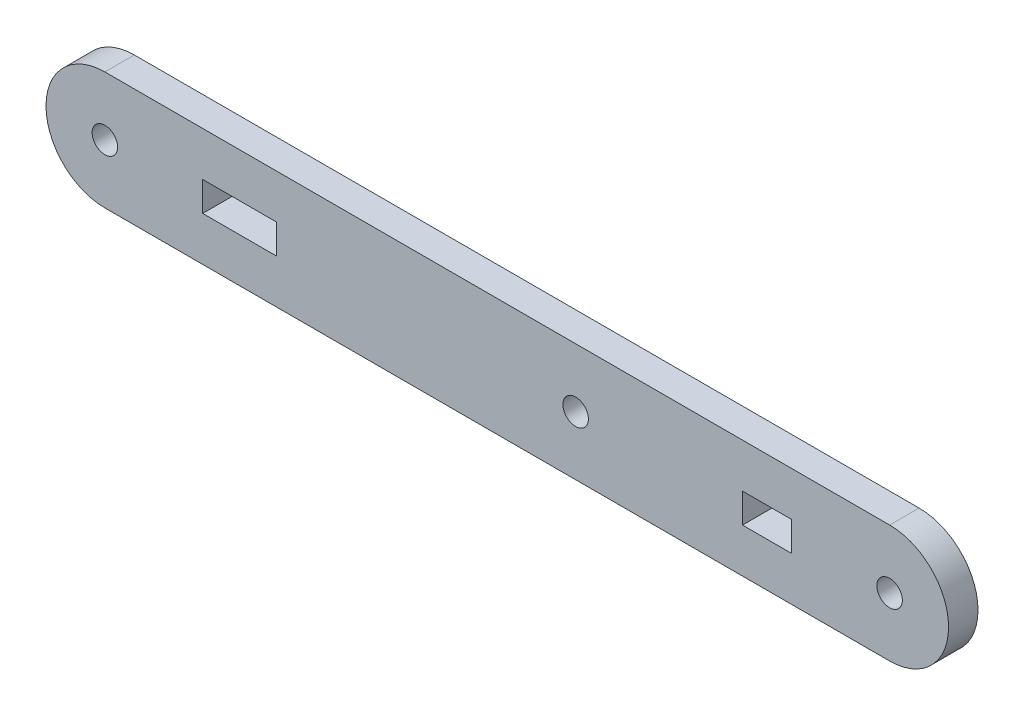
ISO-10303-21;
HEADER;
FILE_DESCRIPTION(('STEP AP214'),'2;1');
FILE_NAME('part.step','',(''),(''),'','','');
FILE_SCHEMA(('AUTOMOTIVE_DESIGN { 1 0 10303 214 1 1 1 1 }'));
ENDSEC;
DATA;
#1=APPLICATION_CONTEXT('core data for automotive mechanical design processes');
#2=APPLICATION_PROTOCOL_DEFINITION('international standard','automotive_design',2000,#1);
#3=PRODUCT_CONTEXT('',#1,'mechanical');
#4=PRODUCT('Part','Part','',(#3));
#5=PRODUCT_RELATED_PRODUCT_CATEGORY('part','',(#4));
#6=PRODUCT_DEFINITION_FORMATION('','',#4);
#7=PRODUCT_DEFINITION_CONTEXT('part definition',#1,'design');
#8=PRODUCT_DEFINITION('design','',#6,#7);
#9=PRODUCT_DEFINITION_SHAPE('','',#8);
#10=(LENGTH_UNIT() NAMED_UNIT(*) SI_UNIT(.MILLI.,.METRE.));
#11=(NAMED_UNIT(*) PLANE_ANGLE_UNIT() SI_UNIT($,.RADIAN.));
#12=(NAMED_UNIT(*) SI_UNIT($,.STERADIAN.) SOLID_ANGLE_UNIT());
#13=UNCERTAINTY_MEASURE_WITH_UNIT(LENGTH_MEASURE(1.E-05),#10,'distance_accuracy_value','');
#14=(GEOMETRIC_REPRESENTATION_CONTEXT(3) GLOBAL_UNCERTAINTY_ASSIGNED_CONTEXT((#13)) GLOBAL_UNIT_ASSIGNED_CONTEXT((#10,
#11,#12)) REPRESENTATION_CONTEXT('',''));
#15=CARTESIAN_POINT('',(0.,0.,0.));
#16=DIRECTION('',(0.,0.,1.));
#17=DIRECTION('',(1.,0.,0.));
#18=AXIS2_PLACEMENT_3D('',#15,#16,#17);
#19=CARTESIAN_POINT('',(-49.3435107871291,6.,0.));
#20=DIRECTION('',(0.,0.,1.));
#21=DIRECTION('',(1.,0.,0.));
#22=AXIS2_PLACEMENT_3D('',#19,#20,#21);
#23=CYLINDRICAL_SURFACE('',#22,6.);
#24=CARTESIAN_POINT('',(-49.3435107871291,6.,3.));
#25=DIRECTION('',(0.,0.,1.));
#26=DIRECTION('',(1.,0.,0.));
#27=AXIS2_PLACEMENT_3D('',#24,#25,#26);
#28=CIRCLE('',#27,6.);
#29=CARTESIAN_POINT('',(-49.3435107871291,12.,3.));
#30=VERTEX_POINT('',#29);
#31=CARTESIAN_POINT('',(-49.3435107871291,0.,3.));
#32=VERTEX_POINT('',#31);
#33=EDGE_CURVE('E210',#30,#32,#28,.T.);
#34=ORIENTED_EDGE('',*,*,#33,.F.);
#35=DIRECTION('',(0.,0.,1.));
#36=VECTOR('',#35,1.);
#37=CARTESIAN_POINT('',(-49.3435107871291,12.,0.));
#38=LINE('',#37,#36);
#39=CARTESIAN_POINT('',(-49.3435107871291,12.,0.));
#40=VERTEX_POINT('',#39);
#41=EDGE_CURVE('E11',#40,#30,#38,.T.);
#42=ORIENTED_EDGE('',*,*,#41,.F.);
#43=CARTESIAN_POINT('',(-49.3435107871291,6.,0.));
#44=DIRECTION('',(0.,0.,1.));
#45=DIRECTION('',(1.,0.,0.));
#46=AXIS2_PLACEMENT_3D('',#43,#44,#45);
#47=CIRCLE('',#46,6.);
#48=CARTESIAN_POINT('',(-49.3435107871291,0.,0.));
#49=VERTEX_POINT('',#48);
#50=EDGE_CURVE('E213',#40,#49,#47,.T.);
#51=ORIENTED_EDGE('',*,*,#50,.T.);
#52=DIRECTION('',(0.,0.,1.));
#53=VECTOR('',#52,1.);
#54=CARTESIAN_POINT('',(-49.3435107871291,0.,0.));
#55=LINE('',#54,#53);
#56=EDGE_CURVE('E40',#49,#32,#55,.T.);
#57=ORIENTED_EDGE('',*,*,#56,.T.);
#58=EDGE_LOOP('',(#34,#42,#51,#57));
#59=FACE_BOUND('',#58,.T.);
#60=ADVANCED_FACE('F37',(#59),#23,.T.);
#61=CARTESIAN_POINT('',(30.6181719329405,12.,0.));
#62=DIRECTION('',(0.,1.,0.));
#63=DIRECTION('',(0.,0.,1.));
#64=AXIS2_PLACEMENT_3D('',#61,#62,#63);
#65=PLANE('',#64);
#66=DIRECTION('',(-1.,0.,0.));
#67=VECTOR('',#66,1.);
#68=CARTESIAN_POINT('',(30.6181719329405,12.,3.));
#69=LINE('',#68,#67);
#70=CARTESIAN_POINT('',(30.6181719329405,12.,3.));
#71=VERTEX_POINT('',#70);
#72=EDGE_CURVE('E217',#71,#30,#69,.T.);
#73=ORIENTED_EDGE('',*,*,#72,.F.);
#74=DIRECTION('',(0.,0.,1.));
#75=VECTOR('',#74,1.);
#76=CARTESIAN_POINT('',(30.6181719329405,12.,0.));
#77=LINE('',#76,#75);
#78=CARTESIAN_POINT('',(30.6181719329405,12.,0.));
#79=VERTEX_POINT('',#78);
#80=EDGE_CURVE('E45',#79,#71,#77,.T.);
#81=ORIENTED_EDGE('',*,*,#80,.F.);
#82=DIRECTION('',(-1.,0.,0.));
#83=VECTOR('',#82,1.);
#84=CARTESIAN_POINT('',(30.6181719329405,12.,0.));
#85=LINE('',#84,#83);
#86=EDGE_CURVE('E223',#79,#40,#85,.T.);
#87=ORIENTED_EDGE('',*,*,#86,.T.);
#88=ORIENTED_EDGE('',*,*,#41,.T.);
#89=EDGE_LOOP('',(#73,#81,#87,#88));
#90=FACE_BOUND('',#89,.T.);
#91=ADVANCED_FACE('F249',(#90),#65,.T.);
#92=CARTESIAN_POINT('',(30.6181719329405,6.,0.));
#93=DIRECTION('',(0.,0.,1.));
#94=DIRECTION('',(1.,0.,0.));
#95=AXIS2_PLACEMENT_3D('',#92,#93,#94);
#96=CYLINDRICAL_SURFACE('',#95,6.);
#97=CARTESIAN_POINT('',(30.6181719329405,6.,3.));
#98=DIRECTION('',(0.,0.,1.));
#99=DIRECTION('',(1.,0.,0.));
#100=AXIS2_PLACEMENT_3D('',#97,#98,#99);
#101=CIRCLE('',#100,6.);
#102=CARTESIAN_POINT('',(30.6181719329405,0.,3.));
#103=VERTEX_POINT('',#102);
#104=EDGE_CURVE('E231',#103,#71,#101,.T.);
#105=ORIENTED_EDGE('',*,*,#104,.F.);
#106=DIRECTION('',(0.,0.,1.));
#107=VECTOR('',#106,1.);
#108=CARTESIAN_POINT('',(30.6181719329405,0.,0.));
#109=LINE('',#108,#107);
#110=CARTESIAN_POINT('',(30.6181719329405,0.,0.));
#111=VERTEX_POINT('',#110);
#112=EDGE_CURVE('E236',#111,#103,#109,.T.);
#113=ORIENTED_EDGE('',*,*,#112,.F.);
#114=CARTESIAN_POINT('',(30.6181719329405,6.,0.));
#115=DIRECTION('',(0.,0.,1.));
#116=DIRECTION('',(1.,0.,0.));
#117=AXIS2_PLACEMENT_3D('',#114,#115,#116);
#118=CIRCLE('',#117,6.);
#119=EDGE_CURVE('E220',#111,#79,#118,.T.);
#120=ORIENTED_EDGE('',*,*,#119,.T.);
#121=ORIENTED_EDGE('',*,*,#80,.T.);
#122=EDGE_LOOP('',(#105,#113,#120,#121));
#123=FACE_BOUND('',#122,.T.);
#124=ADVANCED_FACE('F254',(#123),#96,.T.);
#125=CARTESIAN_POINT('',(-49.3435107871291,0.,0.));
#126=DIRECTION('',(0.,-1.,0.));
#127=DIRECTION('',(0.,0.,-1.));
#128=AXIS2_PLACEMENT_3D('',#125,#126,#127);
#129=PLANE('',#128);
#130=DIRECTION('',(1.,0.,0.));
#131=VECTOR('',#130,1.);
#132=CARTESIAN_POINT('',(-49.3435107871291,0.,3.));
#133=LINE('',#132,#131);
#134=EDGE_CURVE('E228',#32,#103,#133,.T.);
#135=ORIENTED_EDGE('',*,*,#134,.F.);
#136=ORIENTED_EDGE('',*,*,#56,.F.);
#137=DIRECTION('',(1.,0.,0.));
#138=VECTOR('',#137,1.);
#139=CARTESIAN_POINT('',(-49.3435107871291,0.,0.));
#140=LINE('',#139,#138);
#141=EDGE_CURVE('E216',#49,#111,#140,.T.);
#142=ORIENTED_EDGE('',*,*,#141,.T.);
#143=ORIENTED_EDGE('',*,*,#112,.T.);
#144=EDGE_LOOP('',(#135,#136,#142,#143));
#145=FACE_BOUND('',#144,.T.);
#146=ADVANCED_FACE('F244',(#145),#129,.T.);
#147=CARTESIAN_POINT('',(-49.3435107871291,6.,0.));
#148=DIRECTION('',(0.,0.,1.));
#149=DIRECTION('',(1.,0.,0.));
#150=AXIS2_PLACEMENT_3D('',#147,#148,#149);
#151=PLANE('',#150);
#152=DIRECTION('',(1.,0.,0.));
#153=VECTOR('',#152,1.);
#154=CARTESIAN_POINT('',(20.6213066975977,4.4994,0.));
#155=LINE('',#154,#153);
#156=CARTESIAN_POINT('',(15.6218066975976,4.4994,0.));
#157=VERTEX_POINT('',#156);
#158=CARTESIAN_POINT('',(20.6213066975977,4.4994,0.));
#159=VERTEX_POINT('',#158);
#160=EDGE_CURVE('E134',#157,#159,#155,.T.);
#161=ORIENTED_EDGE('',*,*,#160,.T.);
#162=DIRECTION('',(0.,1.,0.));
#163=VECTOR('',#162,1.);
#164=CARTESIAN_POINT('',(20.6213066975977,7.4995,0.));
#165=LINE('',#164,#163);
#166=CARTESIAN_POINT('',(20.6213066975977,7.4995,0.));
#167=VERTEX_POINT('',#166);
#168=EDGE_CURVE('E128',#159,#167,#165,.T.);
#169=ORIENTED_EDGE('',*,*,#168,.T.);
#170=DIRECTION('',(-1.,0.,0.));
#171=VECTOR('',#170,1.);
#172=CARTESIAN_POINT('',(15.6218066975976,7.4995,0.));
#173=LINE('',#172,#171);
#174=CARTESIAN_POINT('',(15.6218066975976,7.4995,0.));
#175=VERTEX_POINT('',#174);
#176=EDGE_CURVE('E137',#167,#175,#173,.T.);
#177=ORIENTED_EDGE('',*,*,#176,.T.);
#178=DIRECTION('',(0.,-1.,0.));
#179=VECTOR('',#178,1.);
#180=CARTESIAN_POINT('',(15.6218066975976,4.4994,0.));
#181=LINE('',#180,#179);
#182=EDGE_CURVE('E53',#175,#157,#181,.T.);
#183=ORIENTED_EDGE('',*,*,#182,.T.);
#184=EDGE_LOOP('',(#161,#169,#177,#183));
#185=FACE_BOUND('',#184,.T.);
#186=DIRECTION('',(1.,0.,0.));
#187=VECTOR('',#186,1.);
#188=CARTESIAN_POINT('',(-31.8790933024023,4.4994,0.));
#189=LINE('',#188,#187);
#190=CARTESIAN_POINT('',(-39.3782933024023,4.4994,0.));
#191=VERTEX_POINT('',#190);
#192=CARTESIAN_POINT('',(-31.8790933024023,4.4994,0.));
#193=VERTEX_POINT('',#192);
#194=EDGE_CURVE('E173',#191,#193,#189,.T.);
#195=ORIENTED_EDGE('',*,*,#194,.T.);
#196=DIRECTION('',(0.,1.,0.));
#197=VECTOR('',#196,1.);
#198=CARTESIAN_POINT('',(-31.8790933024023,7.4995,0.));
#199=LINE('',#198,#197);
#200=CARTESIAN_POINT('',(-31.8790933024023,7.4995,0.));
#201=VERTEX_POINT('',#200);
#202=EDGE_CURVE('E163',#193,#201,#199,.T.);
#203=ORIENTED_EDGE('',*,*,#202,.T.);
#204=DIRECTION('',(-1.,0.,0.));
#205=VECTOR('',#204,1.);
#206=CARTESIAN_POINT('',(-39.3782933024023,7.4995,0.));
#207=LINE('',#206,#205);
#208=CARTESIAN_POINT('',(-39.3782933024023,7.4995,0.));
#209=VERTEX_POINT('',#208);
#210=EDGE_CURVE('E166',#201,#209,#207,.T.);
#211=ORIENTED_EDGE('',*,*,#210,.T.);
#212=DIRECTION('',(0.,-1.,0.));
#213=VECTOR('',#212,1.);
#214=CARTESIAN_POINT('',(-39.3782933024023,4.4994,0.));
#215=LINE('',#214,#213);
#216=EDGE_CURVE('E170',#209,#191,#215,.T.);
#217=ORIENTED_EDGE('',*,*,#216,.T.);
#218=EDGE_LOOP('',(#195,#203,#211,#217));
#219=FACE_BOUND('',#218,.T.);
#220=CARTESIAN_POINT('',(-49.3435107871291,6.,0.));
#221=DIRECTION('',(0.,0.,1.));
#222=DIRECTION('',(-1.,0.,0.));
#223=AXIS2_PLACEMENT_3D('',#220,#221,#222);
#224=CIRCLE('',#223,1.3);
#225=CARTESIAN_POINT('',(-50.6435107871291,6.,0.));
#226=VERTEX_POINT('',#225);
#227=EDGE_CURVE('E195',#226,#226,#224,.T.);
#228=ORIENTED_EDGE('',*,*,#227,.T.);
#229=EDGE_LOOP('',(#228));
#230=FACE_BOUND('',#229,.T.);
#231=CARTESIAN_POINT('',(-1.37928682812217,6.00015,0.));
#232=DIRECTION('',(0.,0.,1.));
#233=DIRECTION('',(-1.,0.,0.));
#234=AXIS2_PLACEMENT_3D('',#231,#232,#233);
#235=CIRCLE('',#234,1.3);
#236=CARTESIAN_POINT('',(-2.67928682812217,6.00015,0.));
#237=VERTEX_POINT('',#236);
#238=EDGE_CURVE('E201',#237,#237,#235,.T.);
#239=ORIENTED_EDGE('',*,*,#238,.T.);
#240=EDGE_LOOP('',(#239));
#241=FACE_BOUND('',#240,.T.);
#242=CARTESIAN_POINT('',(30.6116066975977,6.0001,0.));
#243=DIRECTION('',(0.,0.,1.));
#244=DIRECTION('',(-1.,0.,0.));
#245=AXIS2_PLACEMENT_3D('',#242,#243,#244);
#246=CIRCLE('',#245,1.3);
#247=CARTESIAN_POINT('',(29.3116066975977,6.0001,0.));
#248=VERTEX_POINT('',#247);
#249=EDGE_CURVE('E207',#248,#248,#246,.T.);
#250=ORIENTED_EDGE('',*,*,#249,.T.);
#251=EDGE_LOOP('',(#250));
#252=FACE_BOUND('',#251,.T.);
#253=ORIENTED_EDGE('',*,*,#50,.F.);
#254=ORIENTED_EDGE('',*,*,#86,.F.);
#255=ORIENTED_EDGE('',*,*,#119,.F.);
#256=ORIENTED_EDGE('',*,*,#141,.F.);
#257=EDGE_LOOP('',(#253,#254,#255,#256));
#258=FACE_BOUND('',#257,.T.);
#259=ADVANCED_FACE('F141',(#185,#219,#230,#241,#252,#258),#151,.F.);
#260=CARTESIAN_POINT('',(-49.3435107871291,6.,3.));
#261=DIRECTION('',(0.,0.,1.));
#262=DIRECTION('',(1.,0.,0.));
#263=AXIS2_PLACEMENT_3D('',#260,#261,#262);
#264=PLANE('',#263);
#265=DIRECTION('',(0.,1.,0.));
#266=VECTOR('',#265,1.);
#267=CARTESIAN_POINT('',(20.6213066975977,7.4995,3.));
#268=LINE('',#267,#266);
#269=CARTESIAN_POINT('',(20.6213066975977,4.4994,3.));
#270=VERTEX_POINT('',#269);
#271=CARTESIAN_POINT('',(20.6213066975977,7.4995,3.));
#272=VERTEX_POINT('',#271);
#273=EDGE_CURVE('E61',#270,#272,#268,.T.);
#274=ORIENTED_EDGE('',*,*,#273,.F.);
#275=DIRECTION('',(1.,0.,0.));
#276=VECTOR('',#275,1.);
#277=CARTESIAN_POINT('',(20.6213066975977,4.4994,3.));
#278=LINE('',#277,#276);
#279=CARTESIAN_POINT('',(15.6218066975976,4.4994,3.));
#280=VERTEX_POINT('',#279);
#281=EDGE_CURVE('E144',#280,#270,#278,.T.);
#282=ORIENTED_EDGE('',*,*,#281,.F.);
#283=DIRECTION('',(0.,-1.,0.));
#284=VECTOR('',#283,1.);
#285=CARTESIAN_POINT('',(15.6218066975976,4.4994,3.));
#286=LINE('',#285,#284);
#287=CARTESIAN_POINT('',(15.6218066975976,7.4995,3.));
#288=VERTEX_POINT('',#287);
#289=EDGE_CURVE('E147',#288,#280,#286,.T.);
#290=ORIENTED_EDGE('',*,*,#289,.F.);
#291=DIRECTION('',(-1.,0.,0.));
#292=VECTOR('',#291,1.);
#293=CARTESIAN_POINT('',(15.6218066975976,7.4995,3.));
#294=LINE('',#293,#292);
#295=EDGE_CURVE('E153',#272,#288,#294,.T.);
#296=ORIENTED_EDGE('',*,*,#295,.F.);
#297=EDGE_LOOP('',(#274,#282,#290,#296));
#298=FACE_BOUND('',#297,.T.);
#299=DIRECTION('',(0.,1.,0.));
#300=VECTOR('',#299,1.);
#301=CARTESIAN_POINT('',(-31.8790933024023,7.4995,3.));
#302=LINE('',#301,#300);
#303=CARTESIAN_POINT('',(-31.8790933024023,4.4994,3.));
#304=VERTEX_POINT('',#303);
#305=CARTESIAN_POINT('',(-31.8790933024023,7.4995,3.));
#306=VERTEX_POINT('',#305);
#307=EDGE_CURVE('E159',#304,#306,#302,.T.);
#308=ORIENTED_EDGE('',*,*,#307,.F.);
#309=DIRECTION('',(1.,0.,0.));
#310=VECTOR('',#309,1.);
#311=CARTESIAN_POINT('',(-31.8790933024023,4.4994,3.));
#312=LINE('',#311,#310);
#313=CARTESIAN_POINT('',(-39.3782933024023,4.4994,3.));
#314=VERTEX_POINT('',#313);
#315=EDGE_CURVE('E167',#314,#304,#312,.T.);
#316=ORIENTED_EDGE('',*,*,#315,.F.);
#317=DIRECTION('',(0.,-1.,0.));
#318=VECTOR('',#317,1.);
#319=CARTESIAN_POINT('',(-39.3782933024023,4.4994,3.));
#320=LINE('',#319,#318);
#321=CARTESIAN_POINT('',(-39.3782933024023,7.4995,3.));
#322=VERTEX_POINT('',#321);
#323=EDGE_CURVE('E181',#322,#314,#320,.T.);
#324=ORIENTED_EDGE('',*,*,#323,.F.);
#325=DIRECTION('',(-1.,0.,0.));
#326=VECTOR('',#325,1.);
#327=CARTESIAN_POINT('',(-39.3782933024023,7.4995,3.));
#328=LINE('',#327,#326);
#329=EDGE_CURVE('E178',#306,#322,#328,.T.);
#330=ORIENTED_EDGE('',*,*,#329,.F.);
#331=EDGE_LOOP('',(#308,#316,#324,#330));
#332=FACE_BOUND('',#331,.T.);
#333=CARTESIAN_POINT('',(-49.3435107871291,6.,3.));
#334=DIRECTION('',(0.,0.,1.));
#335=DIRECTION('',(-1.,0.,0.));
#336=AXIS2_PLACEMENT_3D('',#333,#334,#335);
#337=CIRCLE('',#336,1.3);
#338=CARTESIAN_POINT('',(-50.6435107871291,6.,3.));
#339=VERTEX_POINT('',#338);
#340=EDGE_CURVE('E188',#339,#339,#337,.T.);
#341=ORIENTED_EDGE('',*,*,#340,.F.);
#342=EDGE_LOOP('',(#341));
#343=FACE_BOUND('',#342,.T.);
#344=CARTESIAN_POINT('',(-1.37928682812217,6.00015,3.));
#345=DIRECTION('',(0.,0.,1.));
#346=DIRECTION('',(-1.,0.,0.));
#347=AXIS2_PLACEMENT_3D('',#344,#345,#346);
#348=CIRCLE('',#347,1.3);
#349=CARTESIAN_POINT('',(-2.67928682812217,6.00015,3.));
#350=VERTEX_POINT('',#349);
#351=EDGE_CURVE('E198',#350,#350,#348,.T.);
#352=ORIENTED_EDGE('',*,*,#351,.F.);
#353=EDGE_LOOP('',(#352));
#354=FACE_BOUND('',#353,.T.);
#355=CARTESIAN_POINT('',(30.6116066975977,6.0001,3.));
#356=DIRECTION('',(0.,0.,1.));
#357=DIRECTION('',(-1.,0.,0.));
#358=AXIS2_PLACEMENT_3D('',#355,#356,#357);
#359=CIRCLE('',#358,1.3);
#360=CARTESIAN_POINT('',(29.3116066975977,6.0001,3.));
#361=VERTEX_POINT('',#360);
#362=EDGE_CURVE('E204',#361,#361,#359,.T.);
#363=ORIENTED_EDGE('',*,*,#362,.F.);
#364=EDGE_LOOP('',(#363));
#365=FACE_BOUND('',#364,.T.);
#366=ORIENTED_EDGE('',*,*,#33,.T.);
#367=ORIENTED_EDGE('',*,*,#134,.T.);
#368=ORIENTED_EDGE('',*,*,#104,.T.);
#369=ORIENTED_EDGE('',*,*,#72,.T.);
#370=EDGE_LOOP('',(#366,#367,#368,#369));
#371=FACE_BOUND('',#370,.T.);
#372=ADVANCED_FACE('F246',(#298,#332,#343,#354,#365,#371),#264,.T.);
#373=CARTESIAN_POINT('',(30.6116066975977,6.0001,0.));
#374=DIRECTION('',(0.,0.,1.));
#375=DIRECTION('',(1.,0.,0.));
#376=AXIS2_PLACEMENT_3D('',#373,#374,#375);
#377=CYLINDRICAL_SURFACE('',#376,1.3);
#378=ORIENTED_EDGE('',*,*,#249,.F.);
#379=EDGE_LOOP('',(#378));
#380=FACE_BOUND('',#379,.T.);
#381=ORIENTED_EDGE('',*,*,#362,.T.);
#382=EDGE_LOOP('',(#381));
#383=FACE_BOUND('',#382,.T.);
#384=ADVANCED_FACE('F296',(#380,#383),#377,.F.);
#385=CARTESIAN_POINT('',(-1.37928682812217,6.00015,0.));
#386=DIRECTION('',(0.,0.,1.));
#387=DIRECTION('',(1.,0.,0.));
#388=AXIS2_PLACEMENT_3D('',#385,#386,#387);
#389=CYLINDRICAL_SURFACE('',#388,1.3);
#390=ORIENTED_EDGE('',*,*,#238,.F.);
#391=EDGE_LOOP('',(#390));
#392=FACE_BOUND('',#391,.T.);
#393=ORIENTED_EDGE('',*,*,#351,.T.);
#394=EDGE_LOOP('',(#393));
#395=FACE_BOUND('',#394,.T.);
#396=ADVANCED_FACE('F306',(#392,#395),#389,.F.);
#397=CARTESIAN_POINT('',(-49.3435107871291,6.,0.));
#398=DIRECTION('',(0.,0.,1.));
#399=DIRECTION('',(1.,0.,0.));
#400=AXIS2_PLACEMENT_3D('',#397,#398,#399);
#401=CYLINDRICAL_SURFACE('',#400,1.3);
#402=ORIENTED_EDGE('',*,*,#227,.F.);
#403=EDGE_LOOP('',(#402));
#404=FACE_BOUND('',#403,.T.);
#405=ORIENTED_EDGE('',*,*,#340,.T.);
#406=EDGE_LOOP('',(#405));
#407=FACE_BOUND('',#406,.T.);
#408=ADVANCED_FACE('F316',(#404,#407),#401,.F.);
#409=CARTESIAN_POINT('',(-31.8790933024023,7.4995,0.));
#410=DIRECTION('',(1.,0.,0.));
#411=DIRECTION('',(0.,0.,-1.));
#412=AXIS2_PLACEMENT_3D('',#409,#410,#411);
#413=PLANE('',#412);
#414=ORIENTED_EDGE('',*,*,#307,.T.);
#415=DIRECTION('',(0.,0.,1.));
#416=VECTOR('',#415,1.);
#417=CARTESIAN_POINT('',(-31.8790933024023,7.4995,0.));
#418=LINE('',#417,#416);
#419=EDGE_CURVE('E176',#201,#306,#418,.T.);
#420=ORIENTED_EDGE('',*,*,#419,.F.);
#421=ORIENTED_EDGE('',*,*,#202,.F.);
#422=DIRECTION('',(0.,0.,1.));
#423=VECTOR('',#422,1.);
#424=CARTESIAN_POINT('',(-31.8790933024023,4.4994,0.));
#425=LINE('',#424,#423);
#426=EDGE_CURVE('E186',#193,#304,#425,.T.);
#427=ORIENTED_EDGE('',*,*,#426,.T.);
#428=EDGE_LOOP('',(#414,#420,#421,#427));
#429=FACE_BOUND('',#428,.T.);
#430=ADVANCED_FACE('F326',(#429),#413,.F.);
#431=CARTESIAN_POINT('',(-31.8790933024023,4.4994,0.));
#432=DIRECTION('',(0.,-1.,0.));
#433=DIRECTION('',(0.,0.,-1.));
#434=AXIS2_PLACEMENT_3D('',#431,#432,#433);
#435=PLANE('',#434);
#436=ORIENTED_EDGE('',*,*,#315,.T.);
#437=ORIENTED_EDGE('',*,*,#426,.F.);
#438=ORIENTED_EDGE('',*,*,#194,.F.);
#439=DIRECTION('',(0.,0.,1.));
#440=VECTOR('',#439,1.);
#441=CARTESIAN_POINT('',(-39.3782933024023,4.4994,0.));
#442=LINE('',#441,#440);
#443=EDGE_CURVE('E189',#191,#314,#442,.T.);
#444=ORIENTED_EDGE('',*,*,#443,.T.);
#445=EDGE_LOOP('',(#436,#437,#438,#444));
#446=FACE_BOUND('',#445,.T.);
#447=ADVANCED_FACE('F336',(#446),#435,.F.);
#448=CARTESIAN_POINT('',(-39.3782933024023,4.4994,0.));
#449=DIRECTION('',(-1.,0.,0.));
#450=DIRECTION('',(0.,0.,1.));
#451=AXIS2_PLACEMENT_3D('',#448,#449,#450);
#452=PLANE('',#451);
#453=ORIENTED_EDGE('',*,*,#323,.T.);
#454=ORIENTED_EDGE('',*,*,#443,.F.);
#455=ORIENTED_EDGE('',*,*,#216,.F.);
#456=DIRECTION('',(0.,0.,1.));
#457=VECTOR('',#456,1.);
#458=CARTESIAN_POINT('',(-39.3782933024023,7.4995,0.));
#459=LINE('',#458,#457);
#460=EDGE_CURVE('E191',#209,#322,#459,.T.);
#461=ORIENTED_EDGE('',*,*,#460,.T.);
#462=EDGE_LOOP('',(#453,#454,#455,#461));
#463=FACE_BOUND('',#462,.T.);
#464=ADVANCED_FACE('F346',(#463),#452,.F.);
#465=CARTESIAN_POINT('',(-39.3782933024023,7.4995,0.));
#466=DIRECTION('',(0.,1.,0.));
#467=DIRECTION('',(0.,0.,1.));
#468=AXIS2_PLACEMENT_3D('',#465,#466,#467);
#469=PLANE('',#468);
#470=ORIENTED_EDGE('',*,*,#329,.T.);
#471=ORIENTED_EDGE('',*,*,#460,.F.);
#472=ORIENTED_EDGE('',*,*,#210,.F.);
#473=ORIENTED_EDGE('',*,*,#419,.T.);
#474=EDGE_LOOP('',(#470,#471,#472,#473));
#475=FACE_BOUND('',#474,.T.);
#476=ADVANCED_FACE('F356',(#475),#469,.F.);
#477=CARTESIAN_POINT('',(20.6213066975977,7.4995,0.));
#478=DIRECTION('',(1.,0.,0.));
#479=DIRECTION('',(0.,0.,-1.));
#480=AXIS2_PLACEMENT_3D('',#477,#478,#479);
#481=PLANE('',#480);
#482=ORIENTED_EDGE('',*,*,#273,.T.);
#483=DIRECTION('',(0.,0.,1.));
#484=VECTOR('',#483,1.);
#485=CARTESIAN_POINT('',(20.6213066975977,7.4995,0.));
#486=LINE('',#485,#484);
#487=EDGE_CURVE('E124',#167,#272,#486,.T.);
#488=ORIENTED_EDGE('',*,*,#487,.F.);
#489=ORIENTED_EDGE('',*,*,#168,.F.);
#490=DIRECTION('',(0.,0.,1.));
#491=VECTOR('',#490,1.);
#492=CARTESIAN_POINT('',(20.6213066975977,4.4994,0.));
#493=LINE('',#492,#491);
#494=EDGE_CURVE('E157',#159,#270,#493,.T.);
#495=ORIENTED_EDGE('',*,*,#494,.T.);
#496=EDGE_LOOP('',(#482,#488,#489,#495));
#497=FACE_BOUND('',#496,.T.);
#498=ADVANCED_FACE('F126',(#497),#481,.F.);
#499=CARTESIAN_POINT('',(20.6213066975977,4.4994,0.));
#500=DIRECTION('',(0.,-1.,0.));
#501=DIRECTION('',(0.,0.,-1.));
#502=AXIS2_PLACEMENT_3D('',#499,#500,#501);
#503=PLANE('',#502);
#504=ORIENTED_EDGE('',*,*,#281,.T.);
#505=ORIENTED_EDGE('',*,*,#494,.F.);
#506=ORIENTED_EDGE('',*,*,#160,.F.);
#507=DIRECTION('',(0.,0.,1.));
#508=VECTOR('',#507,1.);
#509=CARTESIAN_POINT('',(15.6218066975976,4.4994,0.));
#510=LINE('',#509,#508);
#511=EDGE_CURVE('E160',#157,#280,#510,.T.);
#512=ORIENTED_EDGE('',*,*,#511,.T.);
#513=EDGE_LOOP('',(#504,#505,#506,#512));
#514=FACE_BOUND('',#513,.T.);
#515=ADVANCED_FACE('F375',(#514),#503,.F.);
#516=CARTESIAN_POINT('',(15.6218066975976,4.4994,0.));
#517=DIRECTION('',(-1.,0.,0.));
#518=DIRECTION('',(0.,0.,1.));
#519=AXIS2_PLACEMENT_3D('',#516,#517,#518);
#520=PLANE('',#519);
#521=ORIENTED_EDGE('',*,*,#289,.T.);
#522=ORIENTED_EDGE('',*,*,#511,.F.);
#523=ORIENTED_EDGE('',*,*,#182,.F.);
#524=DIRECTION('',(0.,0.,1.));
#525=VECTOR('',#524,1.);
#526=CARTESIAN_POINT('',(15.6218066975976,7.4995,0.));
#527=LINE('',#526,#525);
#528=EDGE_CURVE('E133',#175,#288,#527,.T.);
#529=ORIENTED_EDGE('',*,*,#528,.T.);
#530=EDGE_LOOP('',(#521,#522,#523,#529));
#531=FACE_BOUND('',#530,.T.);
#532=ADVANCED_FACE('F384',(#531),#520,.F.);
#533=CARTESIAN_POINT('',(15.6218066975976,7.4995,0.));
#534=DIRECTION('',(0.,1.,0.));
#535=DIRECTION('',(0.,0.,1.));
#536=AXIS2_PLACEMENT_3D('',#533,#534,#535);
#537=PLANE('',#536);
#538=ORIENTED_EDGE('',*,*,#295,.T.);
#539=ORIENTED_EDGE('',*,*,#528,.F.);
#540=ORIENTED_EDGE('',*,*,#176,.F.);
#541=ORIENTED_EDGE('',*,*,#487,.T.);
#542=EDGE_LOOP('',(#538,#539,#540,#541));
#543=FACE_BOUND('',#542,.T.);
#544=ADVANCED_FACE('F138',(#543),#537,.F.);
#545=CLOSED_SHELL('',(#60,#91,#124,#146,#259,#372,#384,#396,#408,#430,#447,#464,#476,#498,#515,
#532,#544));
#546=MANIFOLD_SOLID_BREP('B2',#545);
#547=ADVANCED_BREP_SHAPE_REPRESENTATION('',(#18,#546),#14);
#548=SHAPE_DEFINITION_REPRESENTATION(#9,#547);
ENDSEC;
END-ISO-10303-21;
